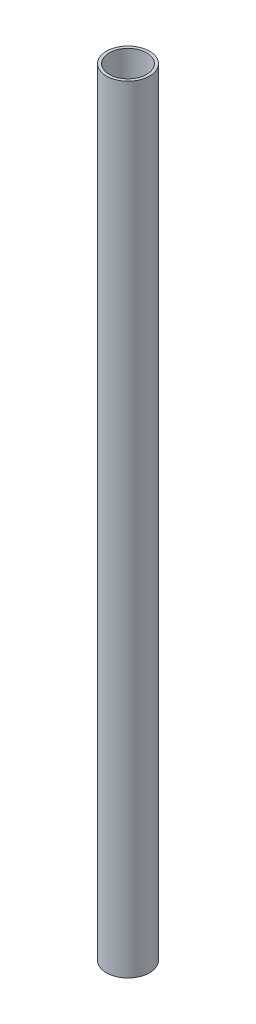
ISO-10303-21;
HEADER;
FILE_DESCRIPTION(('STEP AP214'),'2;1');
FILE_NAME('part.step','',(''),(''),'','','');
FILE_SCHEMA(('AUTOMOTIVE_DESIGN { 1 0 10303 214 1 1 1 1 }'));
ENDSEC;
DATA;
#1=APPLICATION_CONTEXT('core data for automotive mechanical design processes');
#2=APPLICATION_PROTOCOL_DEFINITION('international standard','automotive_design',2000,#1);
#3=PRODUCT_CONTEXT('',#1,'mechanical');
#4=PRODUCT('Part','Part','',(#3));
#5=PRODUCT_RELATED_PRODUCT_CATEGORY('part','',(#4));
#6=PRODUCT_DEFINITION_FORMATION('','',#4);
#7=PRODUCT_DEFINITION_CONTEXT('part definition',#1,'design');
#8=PRODUCT_DEFINITION('design','',#6,#7);
#9=PRODUCT_DEFINITION_SHAPE('','',#8);
#10=(LENGTH_UNIT() NAMED_UNIT(*) SI_UNIT(.MILLI.,.METRE.));
#11=(NAMED_UNIT(*) PLANE_ANGLE_UNIT() SI_UNIT($,.RADIAN.));
#12=(NAMED_UNIT(*) SI_UNIT($,.STERADIAN.) SOLID_ANGLE_UNIT());
#13=UNCERTAINTY_MEASURE_WITH_UNIT(LENGTH_MEASURE(1.E-05),#10,'distance_accuracy_value','');
#14=(GEOMETRIC_REPRESENTATION_CONTEXT(3) GLOBAL_UNCERTAINTY_ASSIGNED_CONTEXT((#13)) GLOBAL_UNIT_ASSIGNED_CONTEXT((#10,
#11,#12)) REPRESENTATION_CONTEXT('',''));
#15=CARTESIAN_POINT('',(0.,0.,0.));
#16=DIRECTION('',(0.,0.,1.));
#17=DIRECTION('',(1.,0.,0.));
#18=AXIS2_PLACEMENT_3D('',#15,#16,#17);
#19=CARTESIAN_POINT('',(0.,270.,0.));
#20=DIRECTION('',(0.,1.,0.));
#21=DIRECTION('',(0.,0.,1.));
#22=AXIS2_PLACEMENT_3D('',#19,#20,#21);
#23=PLANE('',#22);
#24=CARTESIAN_POINT('',(0.,270.,0.));
#25=DIRECTION('',(0.,1.,0.));
#26=DIRECTION('',(0.,0.,1.));
#27=AXIS2_PLACEMENT_3D('',#24,#25,#26);
#28=CIRCLE('',#27,7.5);
#29=CARTESIAN_POINT('',(0.,270.,7.5));
#30=VERTEX_POINT('',#29);
#31=EDGE_CURVE('E10',#30,#30,#28,.T.);
#32=ORIENTED_EDGE('',*,*,#31,.T.);
#33=EDGE_LOOP('',(#32));
#34=FACE_BOUND('',#33,.T.);
#35=CARTESIAN_POINT('',(0.,270.,0.));
#36=DIRECTION('',(0.,1.,0.));
#37=DIRECTION('',(0.,0.,1.));
#38=AXIS2_PLACEMENT_3D('',#35,#36,#37);
#39=CIRCLE('',#38,6.5);
#40=CARTESIAN_POINT('',(0.,270.,6.5));
#41=VERTEX_POINT('',#40);
#42=EDGE_CURVE('E51',#41,#41,#39,.T.);
#43=ORIENTED_EDGE('',*,*,#42,.F.);
#44=EDGE_LOOP('',(#43));
#45=FACE_BOUND('',#44,.T.);
#46=ADVANCED_FACE('F36',(#34,#45),#23,.T.);
#47=CARTESIAN_POINT('',(0.,0.,0.));
#48=DIRECTION('',(0.,1.,0.));
#49=DIRECTION('',(0.,0.,1.));
#50=AXIS2_PLACEMENT_3D('',#47,#48,#49);
#51=PLANE('',#50);
#52=CARTESIAN_POINT('',(0.,0.,0.));
#53=DIRECTION('',(0.,1.,0.));
#54=DIRECTION('',(0.,0.,1.));
#55=AXIS2_PLACEMENT_3D('',#52,#53,#54);
#56=CIRCLE('',#55,7.5);
#57=CARTESIAN_POINT('',(0.,0.,7.5));
#58=VERTEX_POINT('',#57);
#59=EDGE_CURVE('E40',#58,#58,#56,.T.);
#60=ORIENTED_EDGE('',*,*,#59,.F.);
#61=EDGE_LOOP('',(#60));
#62=FACE_BOUND('',#61,.T.);
#63=CARTESIAN_POINT('',(0.,0.,0.));
#64=DIRECTION('',(0.,1.,0.));
#65=DIRECTION('',(0.,0.,1.));
#66=AXIS2_PLACEMENT_3D('',#63,#64,#65);
#67=CIRCLE('',#66,6.5);
#68=CARTESIAN_POINT('',(0.,0.,6.5));
#69=VERTEX_POINT('',#68);
#70=EDGE_CURVE('E53',#69,#69,#67,.T.);
#71=ORIENTED_EDGE('',*,*,#70,.T.);
#72=EDGE_LOOP('',(#71));
#73=FACE_BOUND('',#72,.T.);
#74=ADVANCED_FACE('F63',(#62,#73),#51,.F.);
#75=CARTESIAN_POINT('',(0.,270.,0.));
#76=DIRECTION('',(0.,-1.,0.));
#77=DIRECTION('',(0.,0.,-1.));
#78=AXIS2_PLACEMENT_3D('',#75,#76,#77);
#79=CYLINDRICAL_SURFACE('',#78,7.5);
#80=ORIENTED_EDGE('',*,*,#31,.F.);
#81=EDGE_LOOP('',(#80));
#82=FACE_BOUND('',#81,.T.);
#83=ORIENTED_EDGE('',*,*,#59,.T.);
#84=EDGE_LOOP('',(#83));
#85=FACE_BOUND('',#84,.T.);
#86=ADVANCED_FACE('F38',(#82,#85),#79,.T.);
#87=CARTESIAN_POINT('',(0.,270.,0.));
#88=DIRECTION('',(0.,-1.,0.));
#89=DIRECTION('',(0.,0.,-1.));
#90=AXIS2_PLACEMENT_3D('',#87,#88,#89);
#91=CYLINDRICAL_SURFACE('',#90,6.5);
#92=ORIENTED_EDGE('',*,*,#42,.T.);
#93=EDGE_LOOP('',(#92));
#94=FACE_BOUND('',#93,.T.);
#95=ORIENTED_EDGE('',*,*,#70,.F.);
#96=EDGE_LOOP('',(#95));
#97=FACE_BOUND('',#96,.T.);
#98=ADVANCED_FACE('F59',(#94,#97),#91,.F.);
#99=CLOSED_SHELL('',(#46,#74,#86,#98));
#100=MANIFOLD_SOLID_BREP('B2',#99);
#101=ADVANCED_BREP_SHAPE_REPRESENTATION('',(#18,#100),#14);
#102=SHAPE_DEFINITION_REPRESENTATION(#9,#101);
ENDSEC;
END-ISO-10303-21;
